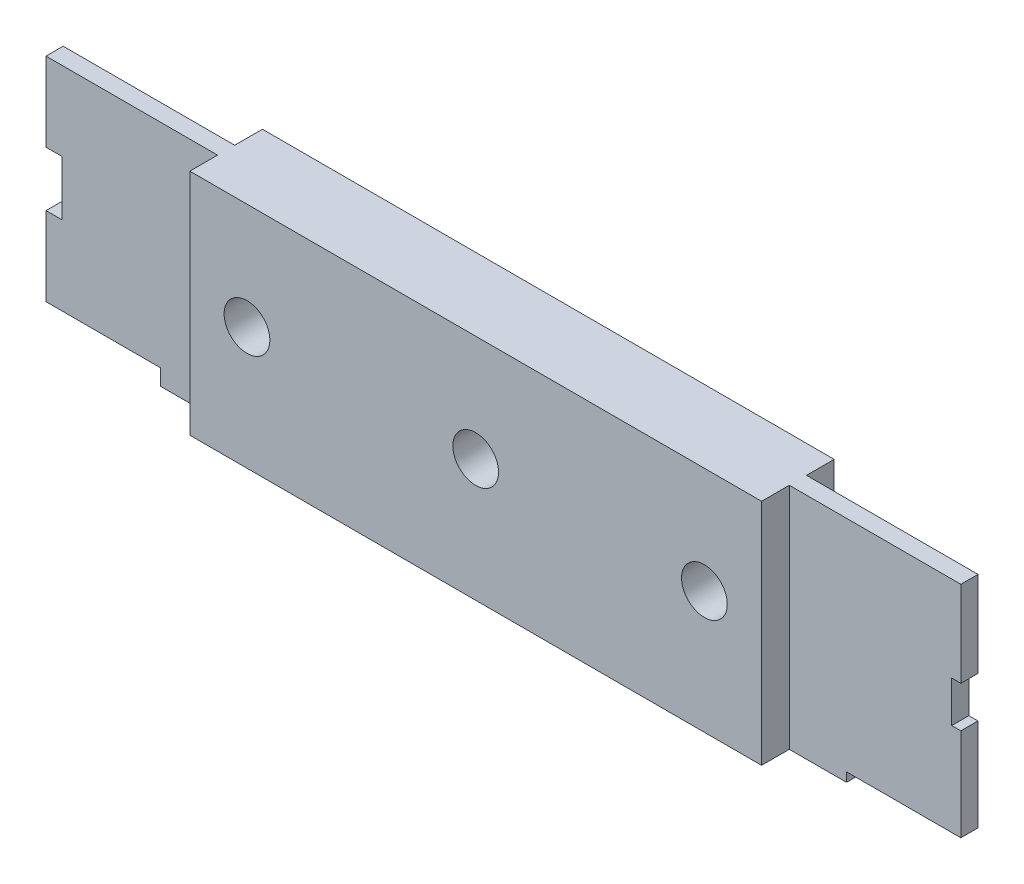
ISO-10303-21;
HEADER;
FILE_DESCRIPTION(('STEP AP214'),'2;1');
FILE_NAME('part.step','',(''),(''),'','','');
FILE_SCHEMA(('AUTOMOTIVE_DESIGN { 1 0 10303 214 1 1 1 1 }'));
ENDSEC;
DATA;
#1=APPLICATION_CONTEXT('core data for automotive mechanical design processes');
#2=APPLICATION_PROTOCOL_DEFINITION('international standard','automotive_design',2000,#1);
#3=PRODUCT_CONTEXT('',#1,'mechanical');
#4=PRODUCT('Part','Part','',(#3));
#5=PRODUCT_RELATED_PRODUCT_CATEGORY('part','',(#4));
#6=PRODUCT_DEFINITION_FORMATION('','',#4);
#7=PRODUCT_DEFINITION_CONTEXT('part definition',#1,'design');
#8=PRODUCT_DEFINITION('design','',#6,#7);
#9=PRODUCT_DEFINITION_SHAPE('','',#8);
#10=(LENGTH_UNIT() NAMED_UNIT(*) SI_UNIT(.MILLI.,.METRE.));
#11=(NAMED_UNIT(*) PLANE_ANGLE_UNIT() SI_UNIT($,.RADIAN.));
#12=(NAMED_UNIT(*) SI_UNIT($,.STERADIAN.) SOLID_ANGLE_UNIT());
#13=UNCERTAINTY_MEASURE_WITH_UNIT(LENGTH_MEASURE(1.E-05),#10,'distance_accuracy_value','');
#14=(GEOMETRIC_REPRESENTATION_CONTEXT(3) GLOBAL_UNCERTAINTY_ASSIGNED_CONTEXT((#13)) GLOBAL_UNIT_ASSIGNED_CONTEXT((#10,
#11,#12)) REPRESENTATION_CONTEXT('',''));
#15=CARTESIAN_POINT('',(0.,0.,0.));
#16=DIRECTION('',(0.,0.,1.));
#17=DIRECTION('',(1.,0.,0.));
#18=AXIS2_PLACEMENT_3D('',#15,#16,#17);
#19=CARTESIAN_POINT('',(0.,0.,0.75));
#20=DIRECTION('',(0.,0.,-1.));
#21=DIRECTION('',(-1.,0.,0.));
#22=AXIS2_PLACEMENT_3D('',#19,#20,#21);
#23=PLANE('',#22);
#24=DIRECTION('',(0.,-1.,0.));
#25=VECTOR('',#24,1.);
#26=CARTESIAN_POINT('',(-25.,0.,0.75));
#27=LINE('',#26,#25);
#28=CARTESIAN_POINT('',(-25.,9.3,0.75));
#29=VERTEX_POINT('',#28);
#30=CARTESIAN_POINT('',(-25.,-10.7,0.75));
#31=VERTEX_POINT('',#30);
#32=EDGE_CURVE('E218',#29,#31,#27,.T.);
#33=ORIENTED_EDGE('',*,*,#32,.F.);
#34=DIRECTION('',(-1.,0.,0.));
#35=VECTOR('',#34,1.);
#36=CARTESIAN_POINT('',(-40.,9.3,0.75));
#37=LINE('',#36,#35);
#38=CARTESIAN_POINT('',(-40.,9.3,0.75));
#39=VERTEX_POINT('',#38);
#40=EDGE_CURVE('E265',#29,#39,#37,.T.);
#41=ORIENTED_EDGE('',*,*,#40,.T.);
#42=DIRECTION('',(0.,-1.,0.));
#43=VECTOR('',#42,1.);
#44=CARTESIAN_POINT('',(-40.,2.4,0.75));
#45=LINE('',#44,#43);
#46=CARTESIAN_POINT('',(-40.,2.4,0.75));
#47=VERTEX_POINT('',#46);
#48=EDGE_CURVE('E233',#39,#47,#45,.T.);
#49=ORIENTED_EDGE('',*,*,#48,.T.);
#50=DIRECTION('',(1.,0.,0.));
#51=VECTOR('',#50,1.);
#52=CARTESIAN_POINT('',(-38.6,2.4,0.75));
#53=LINE('',#52,#51);
#54=CARTESIAN_POINT('',(-38.6,2.4,0.75));
#55=VERTEX_POINT('',#54);
#56=EDGE_CURVE('E236',#47,#55,#53,.T.);
#57=ORIENTED_EDGE('',*,*,#56,.T.);
#58=DIRECTION('',(0.,-1.,0.));
#59=VECTOR('',#58,1.);
#60=CARTESIAN_POINT('',(-38.6,-2.4,0.75));
#61=LINE('',#60,#59);
#62=CARTESIAN_POINT('',(-38.6,-2.4,0.75));
#63=VERTEX_POINT('',#62);
#64=EDGE_CURVE('E239',#55,#63,#61,.T.);
#65=ORIENTED_EDGE('',*,*,#64,.T.);
#66=DIRECTION('',(-1.,0.,0.));
#67=VECTOR('',#66,1.);
#68=CARTESIAN_POINT('',(-40.,-2.4,0.75));
#69=LINE('',#68,#67);
#70=CARTESIAN_POINT('',(-40.,-2.4,0.75));
#71=VERTEX_POINT('',#70);
#72=EDGE_CURVE('E241',#63,#71,#69,.T.);
#73=ORIENTED_EDGE('',*,*,#72,.T.);
#74=DIRECTION('',(0.,-1.,0.));
#75=VECTOR('',#74,1.);
#76=CARTESIAN_POINT('',(-40.,-9.3,0.75));
#77=LINE('',#76,#75);
#78=CARTESIAN_POINT('',(-40.,-9.3,0.75));
#79=VERTEX_POINT('',#78);
#80=EDGE_CURVE('E243',#71,#79,#77,.T.);
#81=ORIENTED_EDGE('',*,*,#80,.T.);
#82=DIRECTION('',(1.,0.,0.));
#83=VECTOR('',#82,1.);
#84=CARTESIAN_POINT('',(-30.,-9.3,0.75));
#85=LINE('',#84,#83);
#86=CARTESIAN_POINT('',(-30.,-9.3,0.75));
#87=VERTEX_POINT('',#86);
#88=EDGE_CURVE('E245',#79,#87,#85,.T.);
#89=ORIENTED_EDGE('',*,*,#88,.T.);
#90=DIRECTION('',(0.,-1.,0.));
#91=VECTOR('',#90,1.);
#92=CARTESIAN_POINT('',(-30.,-10.7,0.75));
#93=LINE('',#92,#91);
#94=CARTESIAN_POINT('',(-30.,-10.7,0.75));
#95=VERTEX_POINT('',#94);
#96=EDGE_CURVE('E247',#87,#95,#93,.T.);
#97=ORIENTED_EDGE('',*,*,#96,.T.);
#98=DIRECTION('',(1.,0.,0.));
#99=VECTOR('',#98,1.);
#100=CARTESIAN_POINT('',(30.,-10.7,0.75));
#101=LINE('',#100,#99);
#102=EDGE_CURVE('E56',#95,#31,#101,.T.);
#103=ORIENTED_EDGE('',*,*,#102,.T.);
#104=EDGE_LOOP('',(#33,#41,#49,#57,#65,#73,#81,#89,#97,#103));
#105=FACE_BOUND('',#104,.T.);
#106=ADVANCED_FACE('F33',(#105),#23,.F.);
#107=DIRECTION('',(0.,1.,0.));
#108=VECTOR('',#107,1.);
#109=CARTESIAN_POINT('',(25.,0.,0.75));
#110=LINE('',#109,#108);
#111=CARTESIAN_POINT('',(25.,-10.7,0.75));
#112=VERTEX_POINT('',#111);
#113=CARTESIAN_POINT('',(25.,9.3,0.75));
#114=VERTEX_POINT('',#113);
#115=EDGE_CURVE('E48',#112,#114,#110,.T.);
#116=ORIENTED_EDGE('',*,*,#115,.F.);
#117=CARTESIAN_POINT('',(30.,-10.7,0.75));
#118=VERTEX_POINT('',#117);
#119=EDGE_CURVE('E249',#112,#118,#101,.T.);
#120=ORIENTED_EDGE('',*,*,#119,.T.);
#121=DIRECTION('',(0.,1.,0.));
#122=VECTOR('',#121,1.);
#123=CARTESIAN_POINT('',(30.,-9.89999999999999,0.75));
#124=LINE('',#123,#122);
#125=CARTESIAN_POINT('',(30.,-9.89999999999999,0.75));
#126=VERTEX_POINT('',#125);
#127=EDGE_CURVE('E251',#118,#126,#124,.T.);
#128=ORIENTED_EDGE('',*,*,#127,.T.);
#129=DIRECTION('',(1.,0.,0.));
#130=VECTOR('',#129,1.);
#131=CARTESIAN_POINT('',(40.,-9.89999999999998,0.75));
#132=LINE('',#131,#130);
#133=CARTESIAN_POINT('',(40.,-9.89999999999998,0.75));
#134=VERTEX_POINT('',#133);
#135=EDGE_CURVE('E253',#126,#134,#132,.T.);
#136=ORIENTED_EDGE('',*,*,#135,.T.);
#137=DIRECTION('',(0.,1.,0.));
#138=VECTOR('',#137,1.);
#139=CARTESIAN_POINT('',(40.,-1.8,0.75));
#140=LINE('',#139,#138);
#141=CARTESIAN_POINT('',(40.,-1.8,0.75));
#142=VERTEX_POINT('',#141);
#143=EDGE_CURVE('E255',#134,#142,#140,.T.);
#144=ORIENTED_EDGE('',*,*,#143,.T.);
#145=DIRECTION('',(-1.,0.,0.));
#146=VECTOR('',#145,1.);
#147=CARTESIAN_POINT('',(39.2,-1.8,0.75));
#148=LINE('',#147,#146);
#149=CARTESIAN_POINT('',(39.2,-1.8,0.75));
#150=VERTEX_POINT('',#149);
#151=EDGE_CURVE('E257',#142,#150,#148,.T.);
#152=ORIENTED_EDGE('',*,*,#151,.T.);
#153=DIRECTION('',(0.,1.,0.));
#154=VECTOR('',#153,1.);
#155=CARTESIAN_POINT('',(39.2,1.8,0.75));
#156=LINE('',#155,#154);
#157=CARTESIAN_POINT('',(39.2,1.8,0.75));
#158=VERTEX_POINT('',#157);
#159=EDGE_CURVE('E259',#150,#158,#156,.T.);
#160=ORIENTED_EDGE('',*,*,#159,.T.);
#161=DIRECTION('',(1.,0.,0.));
#162=VECTOR('',#161,1.);
#163=CARTESIAN_POINT('',(40.,1.8,0.75));
#164=LINE('',#163,#162);
#165=CARTESIAN_POINT('',(40.,1.8,0.75));
#166=VERTEX_POINT('',#165);
#167=EDGE_CURVE('E261',#158,#166,#164,.T.);
#168=ORIENTED_EDGE('',*,*,#167,.T.);
#169=DIRECTION('',(0.,1.,0.));
#170=VECTOR('',#169,1.);
#171=CARTESIAN_POINT('',(40.,9.3,0.75));
#172=LINE('',#171,#170);
#173=CARTESIAN_POINT('',(40.,9.3,0.75));
#174=VERTEX_POINT('',#173);
#175=EDGE_CURVE('E263',#166,#174,#172,.T.);
#176=ORIENTED_EDGE('',*,*,#175,.T.);
#177=EDGE_CURVE('E266',#174,#114,#37,.T.);
#178=ORIENTED_EDGE('',*,*,#177,.T.);
#179=EDGE_LOOP('',(#116,#120,#128,#136,#144,#152,#160,#168,#176,#178));
#180=FACE_BOUND('',#179,.T.);
#181=ADVANCED_FACE('F429',(#180),#23,.F.);
#182=CARTESIAN_POINT('',(0.,0.,-0.75));
#183=DIRECTION('',(0.,0.,-1.));
#184=DIRECTION('',(-1.,0.,0.));
#185=AXIS2_PLACEMENT_3D('',#182,#183,#184);
#186=PLANE('',#185);
#187=DIRECTION('',(-1.,0.,0.));
#188=VECTOR('',#187,1.);
#189=CARTESIAN_POINT('',(-40.,9.3,-0.75));
#190=LINE('',#189,#188);
#191=CARTESIAN_POINT('',(-25.,9.3,-0.75));
#192=VERTEX_POINT('',#191);
#193=CARTESIAN_POINT('',(-40.,9.3,-0.75));
#194=VERTEX_POINT('',#193);
#195=EDGE_CURVE('E301',#192,#194,#190,.T.);
#196=ORIENTED_EDGE('',*,*,#195,.F.);
#197=DIRECTION('',(0.,-1.,0.));
#198=VECTOR('',#197,1.);
#199=CARTESIAN_POINT('',(-25.,0.,-0.75));
#200=LINE('',#199,#198);
#201=CARTESIAN_POINT('',(-25.,-10.7,-0.75));
#202=VERTEX_POINT('',#201);
#203=EDGE_CURVE('E228',#192,#202,#200,.T.);
#204=ORIENTED_EDGE('',*,*,#203,.T.);
#205=DIRECTION('',(1.,0.,0.));
#206=VECTOR('',#205,1.);
#207=CARTESIAN_POINT('',(30.,-10.7,-0.75));
#208=LINE('',#207,#206);
#209=CARTESIAN_POINT('',(-30.,-10.7,-0.75));
#210=VERTEX_POINT('',#209);
#211=EDGE_CURVE('E284',#210,#202,#208,.T.);
#212=ORIENTED_EDGE('',*,*,#211,.F.);
#213=DIRECTION('',(0.,-1.,0.));
#214=VECTOR('',#213,1.);
#215=CARTESIAN_POINT('',(-30.,-10.7,-0.75));
#216=LINE('',#215,#214);
#217=CARTESIAN_POINT('',(-30.,-9.3,-0.75));
#218=VERTEX_POINT('',#217);
#219=EDGE_CURVE('E281',#218,#210,#216,.T.);
#220=ORIENTED_EDGE('',*,*,#219,.F.);
#221=DIRECTION('',(1.,0.,0.));
#222=VECTOR('',#221,1.);
#223=CARTESIAN_POINT('',(-30.,-9.3,-0.75));
#224=LINE('',#223,#222);
#225=CARTESIAN_POINT('',(-40.,-9.3,-0.75));
#226=VERTEX_POINT('',#225);
#227=EDGE_CURVE('E279',#226,#218,#224,.T.);
#228=ORIENTED_EDGE('',*,*,#227,.F.);
#229=DIRECTION('',(0.,-1.,0.));
#230=VECTOR('',#229,1.);
#231=CARTESIAN_POINT('',(-40.,-9.3,-0.75));
#232=LINE('',#231,#230);
#233=CARTESIAN_POINT('',(-40.,-2.4,-0.75));
#234=VERTEX_POINT('',#233);
#235=EDGE_CURVE('E277',#234,#226,#232,.T.);
#236=ORIENTED_EDGE('',*,*,#235,.F.);
#237=DIRECTION('',(-1.,0.,0.));
#238=VECTOR('',#237,1.);
#239=CARTESIAN_POINT('',(-40.,-2.4,-0.75));
#240=LINE('',#239,#238);
#241=CARTESIAN_POINT('',(-38.6,-2.4,-0.75));
#242=VERTEX_POINT('',#241);
#243=EDGE_CURVE('E275',#242,#234,#240,.T.);
#244=ORIENTED_EDGE('',*,*,#243,.F.);
#245=DIRECTION('',(0.,-1.,0.));
#246=VECTOR('',#245,1.);
#247=CARTESIAN_POINT('',(-38.6,-2.4,-0.75));
#248=LINE('',#247,#246);
#249=CARTESIAN_POINT('',(-38.6,2.4,-0.75));
#250=VERTEX_POINT('',#249);
#251=EDGE_CURVE('E273',#250,#242,#248,.T.);
#252=ORIENTED_EDGE('',*,*,#251,.F.);
#253=DIRECTION('',(1.,0.,0.));
#254=VECTOR('',#253,1.);
#255=CARTESIAN_POINT('',(-38.6,2.4,-0.75));
#256=LINE('',#255,#254);
#257=CARTESIAN_POINT('',(-40.,2.4,-0.75));
#258=VERTEX_POINT('',#257);
#259=EDGE_CURVE('E271',#258,#250,#256,.T.);
#260=ORIENTED_EDGE('',*,*,#259,.F.);
#261=DIRECTION('',(0.,-1.,0.));
#262=VECTOR('',#261,1.);
#263=CARTESIAN_POINT('',(-40.,2.4,-0.75));
#264=LINE('',#263,#262);
#265=EDGE_CURVE('E232',#194,#258,#264,.T.);
#266=ORIENTED_EDGE('',*,*,#265,.F.);
#267=EDGE_LOOP('',(#196,#204,#212,#220,#228,#236,#244,#252,#260,#266));
#268=FACE_BOUND('',#267,.T.);
#269=ADVANCED_FACE('F355',(#268),#186,.T.);
#270=CARTESIAN_POINT('',(25.,-10.7,-0.75));
#271=VERTEX_POINT('',#270);
#272=CARTESIAN_POINT('',(30.,-10.7,-0.75));
#273=VERTEX_POINT('',#272);
#274=EDGE_CURVE('E283',#271,#273,#208,.T.);
#275=ORIENTED_EDGE('',*,*,#274,.F.);
#276=DIRECTION('',(0.,1.,0.));
#277=VECTOR('',#276,1.);
#278=CARTESIAN_POINT('',(25.,0.,-0.75));
#279=LINE('',#278,#277);
#280=CARTESIAN_POINT('',(25.,9.3,-0.75));
#281=VERTEX_POINT('',#280);
#282=EDGE_CURVE('E219',#271,#281,#279,.T.);
#283=ORIENTED_EDGE('',*,*,#282,.T.);
#284=CARTESIAN_POINT('',(40.,9.3,-0.75));
#285=VERTEX_POINT('',#284);
#286=EDGE_CURVE('E237',#285,#281,#190,.T.);
#287=ORIENTED_EDGE('',*,*,#286,.F.);
#288=DIRECTION('',(0.,1.,0.));
#289=VECTOR('',#288,1.);
#290=CARTESIAN_POINT('',(40.,9.3,-0.75));
#291=LINE('',#290,#289);
#292=CARTESIAN_POINT('',(40.,1.8,-0.75));
#293=VERTEX_POINT('',#292);
#294=EDGE_CURVE('E299',#293,#285,#291,.T.);
#295=ORIENTED_EDGE('',*,*,#294,.F.);
#296=DIRECTION('',(1.,0.,0.));
#297=VECTOR('',#296,1.);
#298=CARTESIAN_POINT('',(40.,1.8,-0.75));
#299=LINE('',#298,#297);
#300=CARTESIAN_POINT('',(39.2,1.8,-0.75));
#301=VERTEX_POINT('',#300);
#302=EDGE_CURVE('E297',#301,#293,#299,.T.);
#303=ORIENTED_EDGE('',*,*,#302,.F.);
#304=DIRECTION('',(0.,1.,0.));
#305=VECTOR('',#304,1.);
#306=CARTESIAN_POINT('',(39.2,1.8,-0.75));
#307=LINE('',#306,#305);
#308=CARTESIAN_POINT('',(39.2,-1.8,-0.75));
#309=VERTEX_POINT('',#308);
#310=EDGE_CURVE('E295',#309,#301,#307,.T.);
#311=ORIENTED_EDGE('',*,*,#310,.F.);
#312=DIRECTION('',(-1.,0.,0.));
#313=VECTOR('',#312,1.);
#314=CARTESIAN_POINT('',(39.2,-1.8,-0.75));
#315=LINE('',#314,#313);
#316=CARTESIAN_POINT('',(40.,-1.8,-0.75));
#317=VERTEX_POINT('',#316);
#318=EDGE_CURVE('E293',#317,#309,#315,.T.);
#319=ORIENTED_EDGE('',*,*,#318,.F.);
#320=DIRECTION('',(0.,1.,0.));
#321=VECTOR('',#320,1.);
#322=CARTESIAN_POINT('',(40.,-1.8,-0.75));
#323=LINE('',#322,#321);
#324=CARTESIAN_POINT('',(40.,-9.89999999999998,-0.75));
#325=VERTEX_POINT('',#324);
#326=EDGE_CURVE('E291',#325,#317,#323,.T.);
#327=ORIENTED_EDGE('',*,*,#326,.F.);
#328=DIRECTION('',(1.,0.,0.));
#329=VECTOR('',#328,1.);
#330=CARTESIAN_POINT('',(40.,-9.89999999999998,-0.75));
#331=LINE('',#330,#329);
#332=CARTESIAN_POINT('',(30.,-9.89999999999999,-0.75));
#333=VERTEX_POINT('',#332);
#334=EDGE_CURVE('E289',#333,#325,#331,.T.);
#335=ORIENTED_EDGE('',*,*,#334,.F.);
#336=DIRECTION('',(0.,1.,0.));
#337=VECTOR('',#336,1.);
#338=CARTESIAN_POINT('',(30.,-9.89999999999999,-0.75));
#339=LINE('',#338,#337);
#340=EDGE_CURVE('E287',#273,#333,#339,.T.);
#341=ORIENTED_EDGE('',*,*,#340,.F.);
#342=EDGE_LOOP('',(#275,#283,#287,#295,#303,#311,#319,#327,#335,#341));
#343=FACE_BOUND('',#342,.T.);
#344=ADVANCED_FACE('F417',(#343),#186,.T.);
#345=CARTESIAN_POINT('',(-40.,2.4,0.75));
#346=DIRECTION('',(1.,0.,0.));
#347=DIRECTION('',(0.,1.,0.));
#348=AXIS2_PLACEMENT_3D('',#345,#346,#347);
#349=PLANE('',#348);
#350=ORIENTED_EDGE('',*,*,#265,.T.);
#351=DIRECTION('',(0.,0.,-1.));
#352=VECTOR('',#351,1.);
#353=CARTESIAN_POINT('',(-40.,2.4,0.75));
#354=LINE('',#353,#352);
#355=EDGE_CURVE('E11',#47,#258,#354,.T.);
#356=ORIENTED_EDGE('',*,*,#355,.F.);
#357=ORIENTED_EDGE('',*,*,#48,.F.);
#358=DIRECTION('',(0.,0.,-1.));
#359=VECTOR('',#358,1.);
#360=CARTESIAN_POINT('',(-40.,9.3,0.75));
#361=LINE('',#360,#359);
#362=EDGE_CURVE('E268',#39,#194,#361,.T.);
#363=ORIENTED_EDGE('',*,*,#362,.T.);
#364=EDGE_LOOP('',(#350,#356,#357,#363));
#365=FACE_BOUND('',#364,.T.);
#366=ADVANCED_FACE('F35',(#365),#349,.F.);
#367=CARTESIAN_POINT('',(-38.6,2.4,0.75));
#368=DIRECTION('',(0.,1.,0.));
#369=DIRECTION('',(0.,0.,1.));
#370=AXIS2_PLACEMENT_3D('',#367,#368,#369);
#371=PLANE('',#370);
#372=ORIENTED_EDGE('',*,*,#259,.T.);
#373=DIRECTION('',(0.,0.,-1.));
#374=VECTOR('',#373,1.);
#375=CARTESIAN_POINT('',(-38.6,2.4,0.75));
#376=LINE('',#375,#374);
#377=EDGE_CURVE('E41',#55,#250,#376,.T.);
#378=ORIENTED_EDGE('',*,*,#377,.F.);
#379=ORIENTED_EDGE('',*,*,#56,.F.);
#380=ORIENTED_EDGE('',*,*,#355,.T.);
#381=EDGE_LOOP('',(#372,#378,#379,#380));
#382=FACE_BOUND('',#381,.T.);
#383=ADVANCED_FACE('F371',(#382),#371,.F.);
#384=CARTESIAN_POINT('',(-38.6,-2.4,0.75));
#385=DIRECTION('',(1.,0.,0.));
#386=DIRECTION('',(0.,0.,-1.));
#387=AXIS2_PLACEMENT_3D('',#384,#385,#386);
#388=PLANE('',#387);
#389=ORIENTED_EDGE('',*,*,#251,.T.);
#390=DIRECTION('',(0.,0.,-1.));
#391=VECTOR('',#390,1.);
#392=CARTESIAN_POINT('',(-38.6,-2.4,0.75));
#393=LINE('',#392,#391);
#394=EDGE_CURVE('E342',#63,#242,#393,.T.);
#395=ORIENTED_EDGE('',*,*,#394,.F.);
#396=ORIENTED_EDGE('',*,*,#64,.F.);
#397=ORIENTED_EDGE('',*,*,#377,.T.);
#398=EDGE_LOOP('',(#389,#395,#396,#397));
#399=FACE_BOUND('',#398,.T.);
#400=ADVANCED_FACE('F349',(#399),#388,.F.);
#401=CARTESIAN_POINT('',(-40.,-2.4,0.75));
#402=DIRECTION('',(0.,-1.,0.));
#403=DIRECTION('',(0.,0.,-1.));
#404=AXIS2_PLACEMENT_3D('',#401,#402,#403);
#405=PLANE('',#404);
#406=ORIENTED_EDGE('',*,*,#243,.T.);
#407=DIRECTION('',(0.,0.,-1.));
#408=VECTOR('',#407,1.);
#409=CARTESIAN_POINT('',(-40.,-2.4,0.75));
#410=LINE('',#409,#408);
#411=EDGE_CURVE('E339',#71,#234,#410,.T.);
#412=ORIENTED_EDGE('',*,*,#411,.F.);
#413=ORIENTED_EDGE('',*,*,#72,.F.);
#414=ORIENTED_EDGE('',*,*,#394,.T.);
#415=EDGE_LOOP('',(#406,#412,#413,#414));
#416=FACE_BOUND('',#415,.T.);
#417=ADVANCED_FACE('F361',(#416),#405,.F.);
#418=CARTESIAN_POINT('',(-40.,-9.3,0.75));
#419=DIRECTION('',(1.,0.,0.));
#420=DIRECTION('',(0.,1.,0.));
#421=AXIS2_PLACEMENT_3D('',#418,#419,#420);
#422=PLANE('',#421);
#423=ORIENTED_EDGE('',*,*,#235,.T.);
#424=DIRECTION('',(0.,0.,-1.));
#425=VECTOR('',#424,1.);
#426=CARTESIAN_POINT('',(-40.,-9.3,0.75));
#427=LINE('',#426,#425);
#428=EDGE_CURVE('E336',#79,#226,#427,.T.);
#429=ORIENTED_EDGE('',*,*,#428,.F.);
#430=ORIENTED_EDGE('',*,*,#80,.F.);
#431=ORIENTED_EDGE('',*,*,#411,.T.);
#432=EDGE_LOOP('',(#423,#429,#430,#431));
#433=FACE_BOUND('',#432,.T.);
#434=ADVANCED_FACE('F365',(#433),#422,.F.);
#435=CARTESIAN_POINT('',(-30.,-9.3,0.75));
#436=DIRECTION('',(0.,1.,0.));
#437=DIRECTION('',(0.,0.,1.));
#438=AXIS2_PLACEMENT_3D('',#435,#436,#437);
#439=PLANE('',#438);
#440=ORIENTED_EDGE('',*,*,#227,.T.);
#441=DIRECTION('',(0.,0.,-1.));
#442=VECTOR('',#441,1.);
#443=CARTESIAN_POINT('',(-30.,-9.3,0.75));
#444=LINE('',#443,#442);
#445=EDGE_CURVE('E333',#87,#218,#444,.T.);
#446=ORIENTED_EDGE('',*,*,#445,.F.);
#447=ORIENTED_EDGE('',*,*,#88,.F.);
#448=ORIENTED_EDGE('',*,*,#428,.T.);
#449=EDGE_LOOP('',(#440,#446,#447,#448));
#450=FACE_BOUND('',#449,.T.);
#451=ADVANCED_FACE('F505',(#450),#439,.F.);
#452=CARTESIAN_POINT('',(-30.,-10.7,0.75));
#453=DIRECTION('',(1.,0.,0.));
#454=DIRECTION('',(0.,0.,-1.));
#455=AXIS2_PLACEMENT_3D('',#452,#453,#454);
#456=PLANE('',#455);
#457=ORIENTED_EDGE('',*,*,#219,.T.);
#458=DIRECTION('',(0.,0.,-1.));
#459=VECTOR('',#458,1.);
#460=CARTESIAN_POINT('',(-30.,-10.7,0.75));
#461=LINE('',#460,#459);
#462=EDGE_CURVE('E330',#95,#210,#461,.T.);
#463=ORIENTED_EDGE('',*,*,#462,.F.);
#464=ORIENTED_EDGE('',*,*,#96,.F.);
#465=ORIENTED_EDGE('',*,*,#445,.T.);
#466=EDGE_LOOP('',(#457,#463,#464,#465));
#467=FACE_BOUND('',#466,.T.);
#468=ADVANCED_FACE('F502',(#467),#456,.F.);
#469=CARTESIAN_POINT('',(30.,-10.7,0.75));
#470=DIRECTION('',(0.,1.,0.));
#471=DIRECTION('',(-1.,0.,0.));
#472=AXIS2_PLACEMENT_3D('',#469,#470,#471);
#473=PLANE('',#472);
#474=ORIENTED_EDGE('',*,*,#119,.F.);
#475=DIRECTION('',(0.,0.,-1.));
#476=VECTOR('',#475,1.);
#477=CARTESIAN_POINT('',(25.,-10.7,3.175));
#478=LINE('',#477,#476);
#479=CARTESIAN_POINT('',(25.,-10.7,3.175));
#480=VERTEX_POINT('',#479);
#481=EDGE_CURVE('E201',#480,#112,#478,.T.);
#482=ORIENTED_EDGE('',*,*,#481,.F.);
#483=DIRECTION('',(1.,0.,0.));
#484=VECTOR('',#483,1.);
#485=CARTESIAN_POINT('',(-25.,-10.7,3.175));
#486=LINE('',#485,#484);
#487=CARTESIAN_POINT('',(-25.,-10.7,3.175));
#488=VERTEX_POINT('',#487);
#489=EDGE_CURVE('E195',#488,#480,#486,.T.);
#490=ORIENTED_EDGE('',*,*,#489,.F.);
#491=DIRECTION('',(0.,0.,-1.));
#492=VECTOR('',#491,1.);
#493=CARTESIAN_POINT('',(-25.,-10.7,3.175));
#494=LINE('',#493,#492);
#495=EDGE_CURVE('E199',#488,#31,#494,.T.);
#496=ORIENTED_EDGE('',*,*,#495,.T.);
#497=ORIENTED_EDGE('',*,*,#102,.F.);
#498=ORIENTED_EDGE('',*,*,#462,.T.);
#499=ORIENTED_EDGE('',*,*,#211,.T.);
#500=CARTESIAN_POINT('',(-25.,-10.7,-3.175));
#501=VERTEX_POINT('',#500);
#502=EDGE_CURVE('E220',#202,#501,#494,.T.);
#503=ORIENTED_EDGE('',*,*,#502,.T.);
#504=DIRECTION('',(1.,0.,0.));
#505=VECTOR('',#504,1.);
#506=CARTESIAN_POINT('',(-25.,-10.7,-3.175));
#507=LINE('',#506,#505);
#508=CARTESIAN_POINT('',(25.,-10.7,-3.175));
#509=VERTEX_POINT('',#508);
#510=EDGE_CURVE('E391',#501,#509,#507,.T.);
#511=ORIENTED_EDGE('',*,*,#510,.T.);
#512=EDGE_CURVE('E407',#271,#509,#478,.T.);
#513=ORIENTED_EDGE('',*,*,#512,.F.);
#514=ORIENTED_EDGE('',*,*,#274,.T.);
#515=DIRECTION('',(0.,0.,-1.));
#516=VECTOR('',#515,1.);
#517=CARTESIAN_POINT('',(30.,-10.7,0.75));
#518=LINE('',#517,#516);
#519=EDGE_CURVE('E327',#118,#273,#518,.T.);
#520=ORIENTED_EDGE('',*,*,#519,.F.);
#521=EDGE_LOOP('',(#474,#482,#490,#496,#497,#498,#499,#503,#511,#513,#514,#520));
#522=FACE_BOUND('',#521,.T.);
#523=ADVANCED_FACE('F197',(#522),#473,.F.);
#524=CARTESIAN_POINT('',(30.,-9.89999999999999,0.75));
#525=DIRECTION('',(-1.,0.,0.));
#526=DIRECTION('',(0.,0.,1.));
#527=AXIS2_PLACEMENT_3D('',#524,#525,#526);
#528=PLANE('',#527);
#529=ORIENTED_EDGE('',*,*,#340,.T.);
#530=DIRECTION('',(0.,0.,-1.));
#531=VECTOR('',#530,1.);
#532=CARTESIAN_POINT('',(30.,-9.89999999999999,0.75));
#533=LINE('',#532,#531);
#534=EDGE_CURVE('E324',#126,#333,#533,.T.);
#535=ORIENTED_EDGE('',*,*,#534,.F.);
#536=ORIENTED_EDGE('',*,*,#127,.F.);
#537=ORIENTED_EDGE('',*,*,#519,.T.);
#538=EDGE_LOOP('',(#529,#535,#536,#537));
#539=FACE_BOUND('',#538,.T.);
#540=ADVANCED_FACE('F422',(#539),#528,.F.);
#541=CARTESIAN_POINT('',(40.,-9.89999999999998,0.75));
#542=DIRECTION('',(0.,1.,0.));
#543=DIRECTION('',(-1.,0.,0.));
#544=AXIS2_PLACEMENT_3D('',#541,#542,#543);
#545=PLANE('',#544);
#546=ORIENTED_EDGE('',*,*,#334,.T.);
#547=DIRECTION('',(0.,0.,-1.));
#548=VECTOR('',#547,1.);
#549=CARTESIAN_POINT('',(40.,-9.89999999999998,0.75));
#550=LINE('',#549,#548);
#551=EDGE_CURVE('E321',#134,#325,#550,.T.);
#552=ORIENTED_EDGE('',*,*,#551,.F.);
#553=ORIENTED_EDGE('',*,*,#135,.F.);
#554=ORIENTED_EDGE('',*,*,#534,.T.);
#555=EDGE_LOOP('',(#546,#552,#553,#554));
#556=FACE_BOUND('',#555,.T.);
#557=ADVANCED_FACE('F426',(#556),#545,.F.);
#558=CARTESIAN_POINT('',(40.,-1.8,0.75));
#559=DIRECTION('',(-1.,0.,0.));
#560=DIRECTION('',(0.,0.,1.));
#561=AXIS2_PLACEMENT_3D('',#558,#559,#560);
#562=PLANE('',#561);
#563=ORIENTED_EDGE('',*,*,#326,.T.);
#564=DIRECTION('',(0.,0.,-1.));
#565=VECTOR('',#564,1.);
#566=CARTESIAN_POINT('',(40.,-1.8,0.75));
#567=LINE('',#566,#565);
#568=EDGE_CURVE('E318',#142,#317,#567,.T.);
#569=ORIENTED_EDGE('',*,*,#568,.F.);
#570=ORIENTED_EDGE('',*,*,#143,.F.);
#571=ORIENTED_EDGE('',*,*,#551,.T.);
#572=EDGE_LOOP('',(#563,#569,#570,#571));
#573=FACE_BOUND('',#572,.T.);
#574=ADVANCED_FACE('F491',(#573),#562,.F.);
#575=CARTESIAN_POINT('',(39.2,-1.8,0.75));
#576=DIRECTION('',(0.,-1.,0.));
#577=DIRECTION('',(0.,0.,-1.));
#578=AXIS2_PLACEMENT_3D('',#575,#576,#577);
#579=PLANE('',#578);
#580=ORIENTED_EDGE('',*,*,#318,.T.);
#581=DIRECTION('',(0.,0.,-1.));
#582=VECTOR('',#581,1.);
#583=CARTESIAN_POINT('',(39.2,-1.8,0.75));
#584=LINE('',#583,#582);
#585=EDGE_CURVE('E315',#150,#309,#584,.T.);
#586=ORIENTED_EDGE('',*,*,#585,.F.);
#587=ORIENTED_EDGE('',*,*,#151,.F.);
#588=ORIENTED_EDGE('',*,*,#568,.T.);
#589=EDGE_LOOP('',(#580,#586,#587,#588));
#590=FACE_BOUND('',#589,.T.);
#591=ADVANCED_FACE('F487',(#590),#579,.F.);
#592=CARTESIAN_POINT('',(39.2,1.8,0.75));
#593=DIRECTION('',(-1.,0.,0.));
#594=DIRECTION('',(0.,0.,1.));
#595=AXIS2_PLACEMENT_3D('',#592,#593,#594);
#596=PLANE('',#595);
#597=ORIENTED_EDGE('',*,*,#310,.T.);
#598=DIRECTION('',(0.,0.,-1.));
#599=VECTOR('',#598,1.);
#600=CARTESIAN_POINT('',(39.2,1.8,0.75));
#601=LINE('',#600,#599);
#602=EDGE_CURVE('E312',#158,#301,#601,.T.);
#603=ORIENTED_EDGE('',*,*,#602,.F.);
#604=ORIENTED_EDGE('',*,*,#159,.F.);
#605=ORIENTED_EDGE('',*,*,#585,.T.);
#606=EDGE_LOOP('',(#597,#603,#604,#605));
#607=FACE_BOUND('',#606,.T.);
#608=ADVANCED_FACE('F483',(#607),#596,.F.);
#609=CARTESIAN_POINT('',(40.,1.8,0.75));
#610=DIRECTION('',(0.,1.,0.));
#611=DIRECTION('',(0.,0.,1.));
#612=AXIS2_PLACEMENT_3D('',#609,#610,#611);
#613=PLANE('',#612);
#614=ORIENTED_EDGE('',*,*,#302,.T.);
#615=DIRECTION('',(0.,0.,-1.));
#616=VECTOR('',#615,1.);
#617=CARTESIAN_POINT('',(40.,1.8,0.75));
#618=LINE('',#617,#616);
#619=EDGE_CURVE('E309',#166,#293,#618,.T.);
#620=ORIENTED_EDGE('',*,*,#619,.F.);
#621=ORIENTED_EDGE('',*,*,#167,.F.);
#622=ORIENTED_EDGE('',*,*,#602,.T.);
#623=EDGE_LOOP('',(#614,#620,#621,#622));
#624=FACE_BOUND('',#623,.T.);
#625=ADVANCED_FACE('F479',(#624),#613,.F.);
#626=CARTESIAN_POINT('',(40.,9.3,0.75));
#627=DIRECTION('',(-1.,0.,0.));
#628=DIRECTION('',(0.,0.,1.));
#629=AXIS2_PLACEMENT_3D('',#626,#627,#628);
#630=PLANE('',#629);
#631=ORIENTED_EDGE('',*,*,#294,.T.);
#632=DIRECTION('',(0.,0.,-1.));
#633=VECTOR('',#632,1.);
#634=CARTESIAN_POINT('',(40.,9.3,0.75));
#635=LINE('',#634,#633);
#636=EDGE_CURVE('E306',#174,#285,#635,.T.);
#637=ORIENTED_EDGE('',*,*,#636,.F.);
#638=ORIENTED_EDGE('',*,*,#175,.F.);
#639=ORIENTED_EDGE('',*,*,#619,.T.);
#640=EDGE_LOOP('',(#631,#637,#638,#639));
#641=FACE_BOUND('',#640,.T.);
#642=ADVANCED_FACE('F476',(#641),#630,.F.);
#643=CARTESIAN_POINT('',(-40.,9.3,0.75));
#644=DIRECTION('',(0.,-1.,0.));
#645=DIRECTION('',(0.,0.,-1.));
#646=AXIS2_PLACEMENT_3D('',#643,#644,#645);
#647=PLANE('',#646);
#648=ORIENTED_EDGE('',*,*,#286,.T.);
#649=DIRECTION('',(0.,0.,-1.));
#650=VECTOR('',#649,1.);
#651=CARTESIAN_POINT('',(25.,9.3,3.175));
#652=LINE('',#651,#650);
#653=CARTESIAN_POINT('',(25.,9.3,-3.175));
#654=VERTEX_POINT('',#653);
#655=EDGE_CURVE('E404',#281,#654,#652,.T.);
#656=ORIENTED_EDGE('',*,*,#655,.T.);
#657=DIRECTION('',(-1.,0.,0.));
#658=VECTOR('',#657,1.);
#659=CARTESIAN_POINT('',(-25.,9.3,-3.175));
#660=LINE('',#659,#658);
#661=CARTESIAN_POINT('',(-25.,9.3,-3.175));
#662=VERTEX_POINT('',#661);
#663=EDGE_CURVE('E215',#654,#662,#660,.T.);
#664=ORIENTED_EDGE('',*,*,#663,.T.);
#665=DIRECTION('',(0.,0.,-1.));
#666=VECTOR('',#665,1.);
#667=CARTESIAN_POINT('',(-25.,9.3,3.175));
#668=LINE('',#667,#666);
#669=EDGE_CURVE('E379',#192,#662,#668,.T.);
#670=ORIENTED_EDGE('',*,*,#669,.F.);
#671=ORIENTED_EDGE('',*,*,#195,.T.);
#672=ORIENTED_EDGE('',*,*,#362,.F.);
#673=ORIENTED_EDGE('',*,*,#40,.F.);
#674=CARTESIAN_POINT('',(-25.,9.3,3.175));
#675=VERTEX_POINT('',#674);
#676=EDGE_CURVE('E384',#675,#29,#668,.T.);
#677=ORIENTED_EDGE('',*,*,#676,.F.);
#678=DIRECTION('',(-1.,0.,0.));
#679=VECTOR('',#678,1.);
#680=CARTESIAN_POINT('',(-25.,9.3,3.175));
#681=LINE('',#680,#679);
#682=CARTESIAN_POINT('',(25.,9.3,3.175));
#683=VERTEX_POINT('',#682);
#684=EDGE_CURVE('E211',#683,#675,#681,.T.);
#685=ORIENTED_EDGE('',*,*,#684,.F.);
#686=EDGE_CURVE('E405',#683,#114,#652,.T.);
#687=ORIENTED_EDGE('',*,*,#686,.T.);
#688=ORIENTED_EDGE('',*,*,#177,.F.);
#689=ORIENTED_EDGE('',*,*,#636,.T.);
#690=EDGE_LOOP('',(#648,#656,#664,#670,#671,#672,#673,#677,#685,#687,#688,#689));
#691=FACE_BOUND('',#690,.T.);
#692=ADVANCED_FACE('F377',(#691),#647,.F.);
#693=CARTESIAN_POINT('',(25.,9.3,3.175));
#694=DIRECTION('',(-1.,0.,0.));
#695=DIRECTION('',(0.,-1.,0.));
#696=AXIS2_PLACEMENT_3D('',#693,#694,#695);
#697=PLANE('',#696);
#698=ORIENTED_EDGE('',*,*,#282,.F.);
#699=ORIENTED_EDGE('',*,*,#512,.T.);
#700=DIRECTION('',(0.,1.,0.));
#701=VECTOR('',#700,1.);
#702=CARTESIAN_POINT('',(25.,9.3,-3.175));
#703=LINE('',#702,#701);
#704=EDGE_CURVE('E397',#509,#654,#703,.T.);
#705=ORIENTED_EDGE('',*,*,#704,.T.);
#706=ORIENTED_EDGE('',*,*,#655,.F.);
#707=EDGE_LOOP('',(#698,#699,#705,#706));
#708=FACE_BOUND('',#707,.T.);
#709=ADVANCED_FACE('F412',(#708),#697,.F.);
#710=CARTESIAN_POINT('',(-25.,9.3,3.175));
#711=DIRECTION('',(1.,0.,0.));
#712=DIRECTION('',(0.,1.,0.));
#713=AXIS2_PLACEMENT_3D('',#710,#711,#712);
#714=PLANE('',#713);
#715=ORIENTED_EDGE('',*,*,#203,.F.);
#716=ORIENTED_EDGE('',*,*,#669,.T.);
#717=DIRECTION('',(0.,-1.,0.));
#718=VECTOR('',#717,1.);
#719=CARTESIAN_POINT('',(-25.,9.3,-3.175));
#720=LINE('',#719,#718);
#721=EDGE_CURVE('E387',#662,#501,#720,.T.);
#722=ORIENTED_EDGE('',*,*,#721,.T.);
#723=ORIENTED_EDGE('',*,*,#502,.F.);
#724=EDGE_LOOP('',(#715,#716,#722,#723));
#725=FACE_BOUND('',#724,.T.);
#726=ADVANCED_FACE('F386',(#725),#714,.F.);
#727=CARTESIAN_POINT('',(0.,0.,-3.175));
#728=DIRECTION('',(0.,0.,1.));
#729=DIRECTION('',(1.,0.,0.));
#730=AXIS2_PLACEMENT_3D('',#727,#728,#729);
#731=PLANE('',#730);
#732=ORIENTED_EDGE('',*,*,#721,.F.);
#733=ORIENTED_EDGE('',*,*,#663,.F.);
#734=ORIENTED_EDGE('',*,*,#704,.F.);
#735=ORIENTED_EDGE('',*,*,#510,.F.);
#736=EDGE_LOOP('',(#732,#733,#734,#735));
#737=FACE_BOUND('',#736,.T.);
#738=CARTESIAN_POINT('',(-20.,0.,-3.175));
#739=DIRECTION('',(0.,0.,1.));
#740=DIRECTION('',(1.,0.,0.));
#741=AXIS2_PLACEMENT_3D('',#738,#739,#740);
#742=CIRCLE('',#741,2.);
#743=CARTESIAN_POINT('',(-18.,0.,-3.175));
#744=VERTEX_POINT('',#743);
#745=EDGE_CURVE('E435',#744,#744,#742,.T.);
#746=ORIENTED_EDGE('',*,*,#745,.T.);
#747=EDGE_LOOP('',(#746));
#748=FACE_BOUND('',#747,.T.);
#749=CARTESIAN_POINT('',(0.,0.,-3.175));
#750=DIRECTION('',(0.,0.,1.));
#751=DIRECTION('',(1.,0.,0.));
#752=AXIS2_PLACEMENT_3D('',#749,#750,#751);
#753=CIRCLE('',#752,2.);
#754=CARTESIAN_POINT('',(2.,0.,-3.175));
#755=VERTEX_POINT('',#754);
#756=EDGE_CURVE('E441',#755,#755,#753,.T.);
#757=ORIENTED_EDGE('',*,*,#756,.T.);
#758=EDGE_LOOP('',(#757));
#759=FACE_BOUND('',#758,.T.);
#760=CARTESIAN_POINT('',(20.,0.,-3.175));
#761=DIRECTION('',(0.,0.,1.));
#762=DIRECTION('',(1.,0.,0.));
#763=AXIS2_PLACEMENT_3D('',#760,#761,#762);
#764=CIRCLE('',#763,2.);
#765=CARTESIAN_POINT('',(22.,0.,-3.175));
#766=VERTEX_POINT('',#765);
#767=EDGE_CURVE('E447',#766,#766,#764,.T.);
#768=ORIENTED_EDGE('',*,*,#767,.T.);
#769=EDGE_LOOP('',(#768));
#770=FACE_BOUND('',#769,.T.);
#771=ADVANCED_FACE('F394',(#737,#748,#759,#770),#731,.F.);
#772=CARTESIAN_POINT('',(20.,0.,0.75));
#773=DIRECTION('',(0.,0.,-1.));
#774=DIRECTION('',(-1.,0.,0.));
#775=AXIS2_PLACEMENT_3D('',#772,#773,#774);
#776=CYLINDRICAL_SURFACE('',#775,2.);
#777=ORIENTED_EDGE('',*,*,#767,.F.);
#778=EDGE_LOOP('',(#777));
#779=FACE_BOUND('',#778,.T.);
#780=CARTESIAN_POINT('',(20.,0.,3.175));
#781=DIRECTION('',(0.,0.,1.));
#782=DIRECTION('',(1.,0.,0.));
#783=AXIS2_PLACEMENT_3D('',#780,#781,#782);
#784=CIRCLE('',#783,2.);
#785=CARTESIAN_POINT('',(22.,0.,3.175));
#786=VERTEX_POINT('',#785);
#787=EDGE_CURVE('E444',#786,#786,#784,.T.);
#788=ORIENTED_EDGE('',*,*,#787,.T.);
#789=EDGE_LOOP('',(#788));
#790=FACE_BOUND('',#789,.T.);
#791=ADVANCED_FACE('F453',(#779,#790),#776,.F.);
#792=CARTESIAN_POINT('',(0.,0.,0.75));
#793=DIRECTION('',(0.,0.,-1.));
#794=DIRECTION('',(-1.,0.,0.));
#795=AXIS2_PLACEMENT_3D('',#792,#793,#794);
#796=CYLINDRICAL_SURFACE('',#795,2.);
#797=ORIENTED_EDGE('',*,*,#756,.F.);
#798=EDGE_LOOP('',(#797));
#799=FACE_BOUND('',#798,.T.);
#800=CARTESIAN_POINT('',(0.,0.,3.175));
#801=DIRECTION('',(0.,0.,1.));
#802=DIRECTION('',(1.,0.,0.));
#803=AXIS2_PLACEMENT_3D('',#800,#801,#802);
#804=CIRCLE('',#803,2.);
#805=CARTESIAN_POINT('',(2.,0.,3.175));
#806=VERTEX_POINT('',#805);
#807=EDGE_CURVE('E438',#806,#806,#804,.T.);
#808=ORIENTED_EDGE('',*,*,#807,.T.);
#809=EDGE_LOOP('',(#808));
#810=FACE_BOUND('',#809,.T.);
#811=ADVANCED_FACE('F661',(#799,#810),#796,.F.);
#812=CARTESIAN_POINT('',(-20.,0.,0.75));
#813=DIRECTION('',(0.,0.,-1.));
#814=DIRECTION('',(-1.,0.,0.));
#815=AXIS2_PLACEMENT_3D('',#812,#813,#814);
#816=CYLINDRICAL_SURFACE('',#815,2.);
#817=ORIENTED_EDGE('',*,*,#745,.F.);
#818=EDGE_LOOP('',(#817));
#819=FACE_BOUND('',#818,.T.);
#820=CARTESIAN_POINT('',(-20.,0.,3.175));
#821=DIRECTION('',(0.,0.,1.));
#822=DIRECTION('',(1.,0.,0.));
#823=AXIS2_PLACEMENT_3D('',#820,#821,#822);
#824=CIRCLE('',#823,2.);
#825=CARTESIAN_POINT('',(-18.,0.,3.175));
#826=VERTEX_POINT('',#825);
#827=EDGE_CURVE('E400',#826,#826,#824,.T.);
#828=ORIENTED_EDGE('',*,*,#827,.T.);
#829=EDGE_LOOP('',(#828));
#830=FACE_BOUND('',#829,.T.);
#831=ADVANCED_FACE('F671',(#819,#830),#816,.F.);
#832=ORIENTED_EDGE('',*,*,#676,.T.);
#833=ORIENTED_EDGE('',*,*,#32,.T.);
#834=ORIENTED_EDGE('',*,*,#495,.F.);
#835=DIRECTION('',(0.,-1.,0.));
#836=VECTOR('',#835,1.);
#837=CARTESIAN_POINT('',(-25.,9.3,3.175));
#838=LINE('',#837,#836);
#839=EDGE_CURVE('E205',#675,#488,#838,.T.);
#840=ORIENTED_EDGE('',*,*,#839,.F.);
#841=EDGE_LOOP('',(#832,#833,#834,#840));
#842=FACE_BOUND('',#841,.T.);
#843=ADVANCED_FACE('F217',(#842),#714,.F.);
#844=ORIENTED_EDGE('',*,*,#481,.T.);
#845=ORIENTED_EDGE('',*,*,#115,.T.);
#846=ORIENTED_EDGE('',*,*,#686,.F.);
#847=DIRECTION('',(0.,1.,0.));
#848=VECTOR('',#847,1.);
#849=CARTESIAN_POINT('',(25.,9.3,3.175));
#850=LINE('',#849,#848);
#851=EDGE_CURVE('E204',#480,#683,#850,.T.);
#852=ORIENTED_EDGE('',*,*,#851,.F.);
#853=EDGE_LOOP('',(#844,#845,#846,#852));
#854=FACE_BOUND('',#853,.T.);
#855=ADVANCED_FACE('F432',(#854),#697,.F.);
#856=CARTESIAN_POINT('',(0.,0.,3.175));
#857=DIRECTION('',(0.,0.,1.));
#858=DIRECTION('',(1.,0.,0.));
#859=AXIS2_PLACEMENT_3D('',#856,#857,#858);
#860=PLANE('',#859);
#861=ORIENTED_EDGE('',*,*,#807,.F.);
#862=EDGE_LOOP('',(#861));
#863=FACE_BOUND('',#862,.T.);
#864=ORIENTED_EDGE('',*,*,#839,.T.);
#865=ORIENTED_EDGE('',*,*,#489,.T.);
#866=ORIENTED_EDGE('',*,*,#851,.T.);
#867=ORIENTED_EDGE('',*,*,#684,.T.);
#868=EDGE_LOOP('',(#864,#865,#866,#867));
#869=FACE_BOUND('',#868,.T.);
#870=ORIENTED_EDGE('',*,*,#827,.F.);
#871=EDGE_LOOP('',(#870));
#872=FACE_BOUND('',#871,.T.);
#873=ORIENTED_EDGE('',*,*,#787,.F.);
#874=EDGE_LOOP('',(#873));
#875=FACE_BOUND('',#874,.T.);
#876=ADVANCED_FACE('F208',(#863,#869,#872,#875),#860,.T.);
#877=CLOSED_SHELL('',(#106,#181,#269,#344,#366,#383,#400,#417,#434,#451,#468,#523,#540,#557,
#574,#591,#608,#625,#642,#692,#709,#726,#771,#791,#811,#831,#843,#855,#876));
#878=MANIFOLD_SOLID_BREP('B2',#877);
#879=ADVANCED_BREP_SHAPE_REPRESENTATION('',(#18,#878),#14);
#880=SHAPE_DEFINITION_REPRESENTATION(#9,#879);
ENDSEC;
END-ISO-10303-21;
